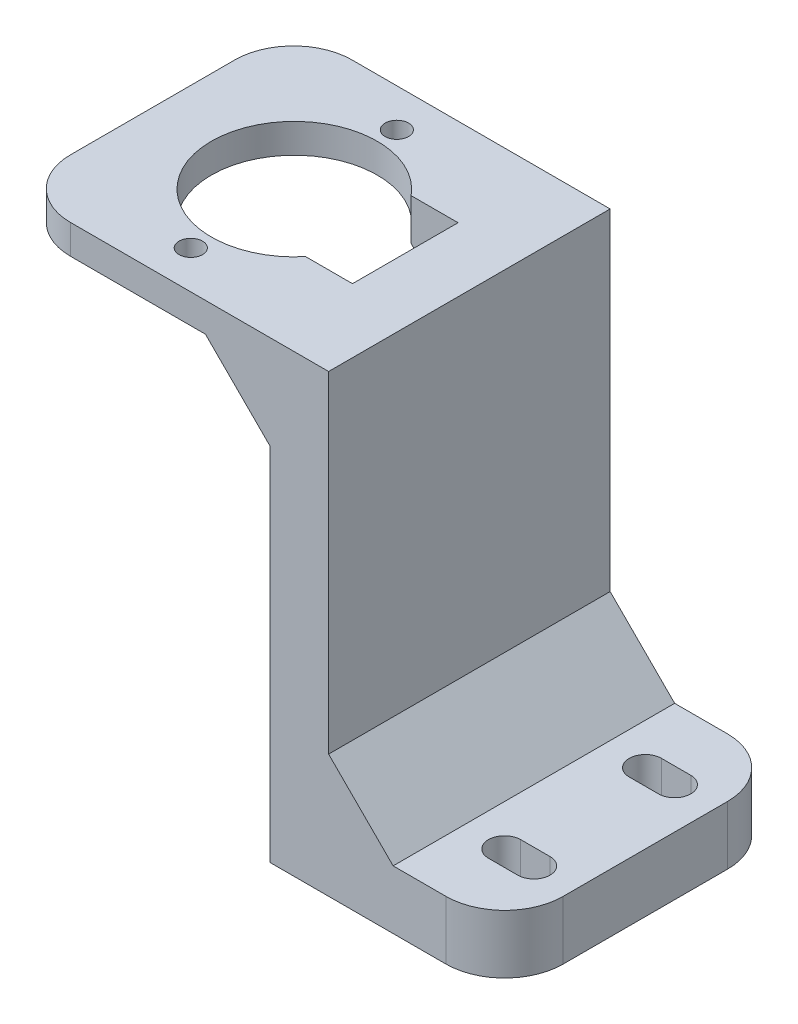
ISO-10303-21;
HEADER;
FILE_DESCRIPTION(('STEP AP214'),'2;1');
FILE_NAME('part.step','',(''),(''),'','','');
FILE_SCHEMA(('AUTOMOTIVE_DESIGN { 1 0 10303 214 1 1 1 1 }'));
ENDSEC;
DATA;
#1=APPLICATION_CONTEXT('core data for automotive mechanical design processes');
#2=APPLICATION_PROTOCOL_DEFINITION('international standard','automotive_design',2000,#1);
#3=PRODUCT_CONTEXT('',#1,'mechanical');
#4=PRODUCT('Part','Part','',(#3));
#5=PRODUCT_RELATED_PRODUCT_CATEGORY('part','',(#4));
#6=PRODUCT_DEFINITION_FORMATION('','',#4);
#7=PRODUCT_DEFINITION_CONTEXT('part definition',#1,'design');
#8=PRODUCT_DEFINITION('design','',#6,#7);
#9=PRODUCT_DEFINITION_SHAPE('','',#8);
#10=(LENGTH_UNIT() NAMED_UNIT(*) SI_UNIT(.MILLI.,.METRE.));
#11=(NAMED_UNIT(*) PLANE_ANGLE_UNIT() SI_UNIT($,.RADIAN.));
#12=(NAMED_UNIT(*) SI_UNIT($,.STERADIAN.) SOLID_ANGLE_UNIT());
#13=UNCERTAINTY_MEASURE_WITH_UNIT(LENGTH_MEASURE(1.E-05),#10,'distance_accuracy_value','');
#14=(GEOMETRIC_REPRESENTATION_CONTEXT(3) GLOBAL_UNCERTAINTY_ASSIGNED_CONTEXT((#13)) GLOBAL_UNIT_ASSIGNED_CONTEXT((#10,
#11,#12)) REPRESENTATION_CONTEXT('',''));
#15=CARTESIAN_POINT('',(0.,0.,0.));
#16=DIRECTION('',(0.,0.,1.));
#17=DIRECTION('',(1.,0.,0.));
#18=AXIS2_PLACEMENT_3D('',#15,#16,#17);
#19=CARTESIAN_POINT('',(30.,5.,-24.));
#20=DIRECTION('',(-1.,0.,0.));
#21=DIRECTION('',(0.,0.,1.));
#22=AXIS2_PLACEMENT_3D('',#19,#20,#21);
#23=PLANE('',#22);
#24=DIRECTION('',(0.,-1.,0.));
#25=VECTOR('',#24,1.);
#26=CARTESIAN_POINT('',(30.,5.,24.));
#27=LINE('',#26,#25);
#28=CARTESIAN_POINT('',(30.,5.,24.));
#29=VERTEX_POINT('',#28);
#30=CARTESIAN_POINT('',(30.,-51.5,24.));
#31=VERTEX_POINT('',#30);
#32=EDGE_CURVE('E517',#29,#31,#27,.T.);
#33=ORIENTED_EDGE('',*,*,#32,.T.);
#34=DIRECTION('',(0.,0.,-1.));
#35=VECTOR('',#34,1.);
#36=CARTESIAN_POINT('',(30.,-51.5,-24.));
#37=LINE('',#36,#35);
#38=CARTESIAN_POINT('',(30.,-51.5,-24.));
#39=VERTEX_POINT('',#38);
#40=EDGE_CURVE('E542',#31,#39,#37,.T.);
#41=ORIENTED_EDGE('',*,*,#40,.T.);
#42=DIRECTION('',(0.,-1.,0.));
#43=VECTOR('',#42,1.);
#44=CARTESIAN_POINT('',(30.,5.,-24.));
#45=LINE('',#44,#43);
#46=CARTESIAN_POINT('',(30.,5.,-24.));
#47=VERTEX_POINT('',#46);
#48=EDGE_CURVE('E508',#47,#39,#45,.T.);
#49=ORIENTED_EDGE('',*,*,#48,.F.);
#50=DIRECTION('',(0.,0.,-1.));
#51=VECTOR('',#50,1.);
#52=CARTESIAN_POINT('',(30.,5.,-24.));
#53=LINE('',#52,#51);
#54=EDGE_CURVE('E503',#29,#47,#53,.T.);
#55=ORIENTED_EDGE('',*,*,#54,.F.);
#56=EDGE_LOOP('',(#33,#41,#49,#55));
#57=FACE_BOUND('',#56,.T.);
#58=ADVANCED_FACE('F190',(#57),#23,.F.);
#59=CARTESIAN_POINT('',(0.,0.,0.));
#60=DIRECTION('',(0.,1.,0.));
#61=DIRECTION('',(0.,0.,1.));
#62=AXIS2_PLACEMENT_3D('',#59,#60,#61);
#63=PLANE('',#62);
#64=CARTESIAN_POINT('',(0.133743502610051,0.,-17.4994889261232));
#65=DIRECTION('',(0.,1.,0.));
#66=DIRECTION('',(0.,0.,1.));
#67=AXIS2_PLACEMENT_3D('',#64,#65,#66);
#68=CIRCLE('',#67,2.);
#69=CARTESIAN_POINT('',(0.133743502610051,0.,-15.4994889261232));
#70=VERTEX_POINT('',#69);
#71=EDGE_CURVE('E464',#70,#70,#68,.T.);
#72=ORIENTED_EDGE('',*,*,#71,.T.);
#73=EDGE_LOOP('',(#72));
#74=FACE_BOUND('',#73,.T.);
#75=CARTESIAN_POINT('',(0.,0.,17.5));
#76=DIRECTION('',(0.,1.,0.));
#77=DIRECTION('',(0.,0.,1.));
#78=AXIS2_PLACEMENT_3D('',#75,#76,#77);
#79=CIRCLE('',#78,2.);
#80=CARTESIAN_POINT('',(0.,0.,19.5));
#81=VERTEX_POINT('',#80);
#82=EDGE_CURVE('E468',#81,#81,#79,.T.);
#83=ORIENTED_EDGE('',*,*,#82,.T.);
#84=EDGE_LOOP('',(#83));
#85=FACE_BOUND('',#84,.T.);
#86=DIRECTION('',(-1.,0.,0.));
#87=VECTOR('',#86,1.);
#88=CARTESIAN_POINT('',(-24.,0.,-24.));
#89=LINE('',#88,#87);
#90=CARTESIAN_POINT('',(8.99999999999993,0.,-24.));
#91=VERTEX_POINT('',#90);
#92=CARTESIAN_POINT('',(-14.,0.,-24.));
#93=VERTEX_POINT('',#92);
#94=EDGE_CURVE('E501',#91,#93,#89,.T.);
#95=ORIENTED_EDGE('',*,*,#94,.F.);
#96=DIRECTION('',(0.,0.,1.));
#97=VECTOR('',#96,1.);
#98=CARTESIAN_POINT('',(8.99999999999992,0.,24.));
#99=LINE('',#98,#97);
#100=CARTESIAN_POINT('',(8.99999999999993,0.,-11.0408333018845));
#101=VERTEX_POINT('',#100);
#102=EDGE_CURVE('E549',#91,#101,#99,.T.);
#103=ORIENTED_EDGE('',*,*,#102,.T.);
#104=CARTESIAN_POINT('',(0.150000000000006,0.,0.));
#105=DIRECTION('',(0.,1.,0.));
#106=DIRECTION('',(0.,0.,1.));
#107=AXIS2_PLACEMENT_3D('',#104,#105,#106);
#108=CIRCLE('',#107,14.15);
#109=CARTESIAN_POINT('',(8.99999999999992,0.,11.0408333018845));
#110=VERTEX_POINT('',#109);
#111=EDGE_CURVE('E474',#101,#110,#108,.T.);
#112=ORIENTED_EDGE('',*,*,#111,.T.);
#113=DIRECTION('',(0.,0.,1.));
#114=VECTOR('',#113,1.);
#115=CARTESIAN_POINT('',(8.99999999999992,0.,24.));
#116=LINE('',#115,#114);
#117=CARTESIAN_POINT('',(8.99999999999992,0.,24.));
#118=VERTEX_POINT('',#117);
#119=EDGE_CURVE('E547',#110,#118,#116,.T.);
#120=ORIENTED_EDGE('',*,*,#119,.T.);
#121=DIRECTION('',(1.,0.,0.));
#122=VECTOR('',#121,1.);
#123=CARTESIAN_POINT('',(-24.,0.,24.));
#124=LINE('',#123,#122);
#125=CARTESIAN_POINT('',(-14.,0.,24.));
#126=VERTEX_POINT('',#125);
#127=EDGE_CURVE('E511',#126,#118,#124,.T.);
#128=ORIENTED_EDGE('',*,*,#127,.F.);
#129=CARTESIAN_POINT('',(-14.,0.,14.));
#130=DIRECTION('',(0.,1.,0.));
#131=DIRECTION('',(0.,0.,1.));
#132=AXIS2_PLACEMENT_3D('',#129,#130,#131);
#133=CIRCLE('',#132,10.);
#134=CARTESIAN_POINT('',(-24.,0.,14.));
#135=VERTEX_POINT('',#134);
#136=EDGE_CURVE('E525',#126,#135,#133,.F.);
#137=ORIENTED_EDGE('',*,*,#136,.T.);
#138=DIRECTION('',(0.,0.,1.));
#139=VECTOR('',#138,1.);
#140=CARTESIAN_POINT('',(-24.,0.,-24.));
#141=LINE('',#140,#139);
#142=CARTESIAN_POINT('',(-24.,0.,-14.));
#143=VERTEX_POINT('',#142);
#144=EDGE_CURVE('E496',#143,#135,#141,.T.);
#145=ORIENTED_EDGE('',*,*,#144,.F.);
#146=CARTESIAN_POINT('',(-14.,0.,-14.));
#147=DIRECTION('',(0.,1.,0.));
#148=DIRECTION('',(0.,0.,1.));
#149=AXIS2_PLACEMENT_3D('',#146,#147,#148);
#150=CIRCLE('',#149,10.);
#151=EDGE_CURVE('E527',#143,#93,#150,.F.);
#152=ORIENTED_EDGE('',*,*,#151,.T.);
#153=EDGE_LOOP('',(#95,#103,#112,#120,#128,#137,#145,#152));
#154=FACE_BOUND('',#153,.T.);
#155=ADVANCED_FACE('F620',(#74,#85,#154),#63,.F.);
#156=CARTESIAN_POINT('',(0.,5.,0.));
#157=DIRECTION('',(0.,1.,0.));
#158=DIRECTION('',(0.,0.,1.));
#159=AXIS2_PLACEMENT_3D('',#156,#157,#158);
#160=PLANE('',#159);
#161=CARTESIAN_POINT('',(0.,5.,17.5));
#162=DIRECTION('',(0.,1.,0.));
#163=DIRECTION('',(0.,0.,1.));
#164=AXIS2_PLACEMENT_3D('',#161,#162,#163);
#165=CIRCLE('',#164,2.);
#166=CARTESIAN_POINT('',(0.,5.,19.5));
#167=VERTEX_POINT('',#166);
#168=EDGE_CURVE('E471',#167,#167,#165,.T.);
#169=ORIENTED_EDGE('',*,*,#168,.F.);
#170=EDGE_LOOP('',(#169));
#171=FACE_BOUND('',#170,.T.);
#172=DIRECTION('',(-1.,0.,0.));
#173=VECTOR('',#172,1.);
#174=CARTESIAN_POINT('',(-24.,5.,-24.));
#175=LINE('',#174,#173);
#176=CARTESIAN_POINT('',(-14.,5.,-24.));
#177=VERTEX_POINT('',#176);
#178=EDGE_CURVE('E505',#47,#177,#175,.T.);
#179=ORIENTED_EDGE('',*,*,#178,.T.);
#180=CARTESIAN_POINT('',(-14.,5.,-14.));
#181=DIRECTION('',(0.,1.,0.));
#182=DIRECTION('',(0.,0.,1.));
#183=AXIS2_PLACEMENT_3D('',#180,#181,#182);
#184=CIRCLE('',#183,10.);
#185=CARTESIAN_POINT('',(-24.,5.,-14.));
#186=VERTEX_POINT('',#185);
#187=EDGE_CURVE('E534',#177,#186,#184,.T.);
#188=ORIENTED_EDGE('',*,*,#187,.T.);
#189=DIRECTION('',(0.,0.,1.));
#190=VECTOR('',#189,1.);
#191=CARTESIAN_POINT('',(-24.,5.,-24.));
#192=LINE('',#191,#190);
#193=CARTESIAN_POINT('',(-24.,5.,14.));
#194=VERTEX_POINT('',#193);
#195=EDGE_CURVE('E497',#186,#194,#192,.T.);
#196=ORIENTED_EDGE('',*,*,#195,.T.);
#197=CARTESIAN_POINT('',(-14.,5.,14.));
#198=DIRECTION('',(0.,1.,0.));
#199=DIRECTION('',(0.,0.,1.));
#200=AXIS2_PLACEMENT_3D('',#197,#198,#199);
#201=CIRCLE('',#200,10.);
#202=CARTESIAN_POINT('',(-14.,5.,24.));
#203=VERTEX_POINT('',#202);
#204=EDGE_CURVE('E532',#194,#203,#201,.T.);
#205=ORIENTED_EDGE('',*,*,#204,.T.);
#206=DIRECTION('',(1.,0.,0.));
#207=VECTOR('',#206,1.);
#208=CARTESIAN_POINT('',(-24.,5.,24.));
#209=LINE('',#208,#207);
#210=EDGE_CURVE('E500',#203,#29,#209,.T.);
#211=ORIENTED_EDGE('',*,*,#210,.T.);
#212=ORIENTED_EDGE('',*,*,#54,.T.);
#213=EDGE_LOOP('',(#179,#188,#196,#205,#211,#212));
#214=FACE_BOUND('',#213,.T.);
#215=DIRECTION('',(-1.,0.,0.));
#216=VECTOR('',#215,1.);
#217=CARTESIAN_POINT('',(19.0689056228177,5.,-9.00000000000001));
#218=LINE('',#217,#216);
#219=CARTESIAN_POINT('',(19.0689056228177,5.,-9.00000000000001));
#220=VERTEX_POINT('',#219);
#221=CARTESIAN_POINT('',(11.0689056228177,5.,-9.00000000000001));
#222=VERTEX_POINT('',#221);
#223=EDGE_CURVE('E479',#220,#222,#218,.T.);
#224=ORIENTED_EDGE('',*,*,#223,.F.);
#225=DIRECTION('',(0.,0.,-1.));
#226=VECTOR('',#225,1.);
#227=CARTESIAN_POINT('',(19.0689056228177,5.,-9.00000000000001));
#228=LINE('',#227,#226);
#229=CARTESIAN_POINT('',(19.0689056228177,5.,8.99999999999999));
#230=VERTEX_POINT('',#229);
#231=EDGE_CURVE('E477',#230,#220,#228,.T.);
#232=ORIENTED_EDGE('',*,*,#231,.F.);
#233=DIRECTION('',(1.,0.,0.));
#234=VECTOR('',#233,1.);
#235=CARTESIAN_POINT('',(19.0689056228177,5.,8.99999999999999));
#236=LINE('',#235,#234);
#237=CARTESIAN_POINT('',(11.0689056228177,5.,8.99999999999999));
#238=VERTEX_POINT('',#237);
#239=EDGE_CURVE('E484',#238,#230,#236,.T.);
#240=ORIENTED_EDGE('',*,*,#239,.F.);
#241=CARTESIAN_POINT('',(0.150000000000006,5.,0.));
#242=DIRECTION('',(0.,1.,0.));
#243=DIRECTION('',(0.,0.,1.));
#244=AXIS2_PLACEMENT_3D('',#241,#242,#243);
#245=CIRCLE('',#244,14.15);
#246=EDGE_CURVE('E481',#222,#238,#245,.T.);
#247=ORIENTED_EDGE('',*,*,#246,.F.);
#248=EDGE_LOOP('',(#224,#232,#240,#247));
#249=FACE_BOUND('',#248,.T.);
#250=CARTESIAN_POINT('',(0.133743502610051,5.,-17.4994889261232));
#251=DIRECTION('',(0.,1.,0.));
#252=DIRECTION('',(0.,0.,1.));
#253=AXIS2_PLACEMENT_3D('',#250,#251,#252);
#254=CIRCLE('',#253,2.);
#255=CARTESIAN_POINT('',(0.133743502610051,5.,-15.4994889261232));
#256=VERTEX_POINT('',#255);
#257=EDGE_CURVE('E465',#256,#256,#254,.T.);
#258=ORIENTED_EDGE('',*,*,#257,.F.);
#259=EDGE_LOOP('',(#258));
#260=FACE_BOUND('',#259,.T.);
#261=ADVANCED_FACE('F648',(#171,#214,#249,#260),#160,.T.);
#262=CARTESIAN_POINT('',(-24.,5.,-24.));
#263=DIRECTION('',(1.,0.,0.));
#264=DIRECTION('',(0.,0.,-1.));
#265=AXIS2_PLACEMENT_3D('',#262,#263,#264);
#266=PLANE('',#265);
#267=ORIENTED_EDGE('',*,*,#195,.F.);
#268=DIRECTION('',(0.,-1.,0.));
#269=VECTOR('',#268,1.);
#270=CARTESIAN_POINT('',(-24.,5.,-14.));
#271=LINE('',#270,#269);
#272=EDGE_CURVE('E522',#186,#143,#271,.T.);
#273=ORIENTED_EDGE('',*,*,#272,.T.);
#274=ORIENTED_EDGE('',*,*,#144,.T.);
#275=DIRECTION('',(0.,-1.,0.));
#276=VECTOR('',#275,1.);
#277=CARTESIAN_POINT('',(-24.,5.,14.));
#278=LINE('',#277,#276);
#279=EDGE_CURVE('E520',#135,#194,#278,.F.);
#280=ORIENTED_EDGE('',*,*,#279,.T.);
#281=EDGE_LOOP('',(#267,#273,#274,#280));
#282=FACE_BOUND('',#281,.T.);
#283=ADVANCED_FACE('F643',(#282),#266,.F.);
#284=CARTESIAN_POINT('',(-24.,5.,24.));
#285=DIRECTION('',(0.,0.,-1.));
#286=DIRECTION('',(-1.,0.,0.));
#287=AXIS2_PLACEMENT_3D('',#284,#285,#286);
#288=PLANE('',#287);
#289=DIRECTION('',(-1.,0.,0.));
#290=VECTOR('',#289,1.);
#291=CARTESIAN_POINT('',(30.,-72.5,24.));
#292=LINE('',#291,#290);
#293=CARTESIAN_POINT('',(50.,-72.5,24.));
#294=VERTEX_POINT('',#293);
#295=CARTESIAN_POINT('',(20.,-72.5,24.));
#296=VERTEX_POINT('',#295);
#297=EDGE_CURVE('E452',#294,#296,#292,.T.);
#298=ORIENTED_EDGE('',*,*,#297,.F.);
#299=DIRECTION('',(0.,-1.,0.));
#300=VECTOR('',#299,1.);
#301=CARTESIAN_POINT('',(50.,5.,24.));
#302=LINE('',#301,#300);
#303=CARTESIAN_POINT('',(50.,-62.5,24.));
#304=VERTEX_POINT('',#303);
#305=EDGE_CURVE('E13',#294,#304,#302,.F.);
#306=ORIENTED_EDGE('',*,*,#305,.T.);
#307=DIRECTION('',(-1.,0.,0.));
#308=VECTOR('',#307,1.);
#309=CARTESIAN_POINT('',(60.,-62.5,24.));
#310=LINE('',#309,#308);
#311=CARTESIAN_POINT('',(41.0000000000001,-62.5,24.));
#312=VERTEX_POINT('',#311);
#313=EDGE_CURVE('E448',#304,#312,#310,.T.);
#314=ORIENTED_EDGE('',*,*,#313,.T.);
#315=DIRECTION('',(0.707106781186551,-0.707106781186544,0.));
#316=VECTOR('',#315,1.);
#317=CARTESIAN_POINT('',(-25.2500000000003,3.74999999999969,24.));
#318=LINE('',#317,#316);
#319=EDGE_CURVE('E551',#312,#31,#318,.F.);
#320=ORIENTED_EDGE('',*,*,#319,.T.);
#321=ORIENTED_EDGE('',*,*,#32,.F.);
#322=ORIENTED_EDGE('',*,*,#210,.F.);
#323=DIRECTION('',(0.,-1.,0.));
#324=VECTOR('',#323,1.);
#325=CARTESIAN_POINT('',(-14.,5.,24.));
#326=LINE('',#325,#324);
#327=EDGE_CURVE('E536',#203,#126,#326,.T.);
#328=ORIENTED_EDGE('',*,*,#327,.T.);
#329=ORIENTED_EDGE('',*,*,#127,.T.);
#330=DIRECTION('',(-0.707106781186544,0.707106781186551,0.));
#331=VECTOR('',#330,1.);
#332=CARTESIAN_POINT('',(-9.99999999999986,19.,24.));
#333=LINE('',#332,#331);
#334=CARTESIAN_POINT('',(20.,-11.0000000000002,24.));
#335=VERTEX_POINT('',#334);
#336=EDGE_CURVE('E572',#118,#335,#333,.F.);
#337=ORIENTED_EDGE('',*,*,#336,.T.);
#338=DIRECTION('',(0.,1.,0.));
#339=VECTOR('',#338,1.);
#340=CARTESIAN_POINT('',(20.,-72.5,24.));
#341=LINE('',#340,#339);
#342=EDGE_CURVE('E461',#296,#335,#341,.T.);
#343=ORIENTED_EDGE('',*,*,#342,.F.);
#344=EDGE_LOOP('',(#298,#306,#314,#320,#321,#322,#328,#329,#337,#343));
#345=FACE_BOUND('',#344,.T.);
#346=ADVANCED_FACE('F609',(#345),#288,.F.);
#347=CARTESIAN_POINT('',(-24.,5.,-24.));
#348=DIRECTION('',(0.,0.,1.));
#349=DIRECTION('',(1.,0.,0.));
#350=AXIS2_PLACEMENT_3D('',#347,#348,#349);
#351=PLANE('',#350);
#352=DIRECTION('',(-1.,0.,0.));
#353=VECTOR('',#352,1.);
#354=CARTESIAN_POINT('',(60.,-62.5,-24.));
#355=LINE('',#354,#353);
#356=CARTESIAN_POINT('',(50.,-62.5,-24.));
#357=VERTEX_POINT('',#356);
#358=CARTESIAN_POINT('',(41.0000000000001,-62.5,-24.));
#359=VERTEX_POINT('',#358);
#360=EDGE_CURVE('E450',#357,#359,#355,.T.);
#361=ORIENTED_EDGE('',*,*,#360,.F.);
#362=DIRECTION('',(0.,1.,0.));
#363=VECTOR('',#362,1.);
#364=CARTESIAN_POINT('',(50.,5.,-24.));
#365=LINE('',#364,#363);
#366=CARTESIAN_POINT('',(50.,-72.5,-24.));
#367=VERTEX_POINT('',#366);
#368=EDGE_CURVE('E213',#357,#367,#365,.F.);
#369=ORIENTED_EDGE('',*,*,#368,.T.);
#370=DIRECTION('',(1.,0.,0.));
#371=VECTOR('',#370,1.);
#372=CARTESIAN_POINT('',(30.,-72.5,-24.));
#373=LINE('',#372,#371);
#374=CARTESIAN_POINT('',(20.,-72.5,-24.));
#375=VERTEX_POINT('',#374);
#376=EDGE_CURVE('E456',#375,#367,#373,.T.);
#377=ORIENTED_EDGE('',*,*,#376,.F.);
#378=DIRECTION('',(0.,1.,0.));
#379=VECTOR('',#378,1.);
#380=CARTESIAN_POINT('',(20.,-72.5,-24.));
#381=LINE('',#380,#379);
#382=CARTESIAN_POINT('',(20.,-11.0000000000002,-24.));
#383=VERTEX_POINT('',#382);
#384=EDGE_CURVE('E458',#375,#383,#381,.T.);
#385=ORIENTED_EDGE('',*,*,#384,.T.);
#386=DIRECTION('',(0.707106781186544,-0.707106781186551,0.));
#387=VECTOR('',#386,1.);
#388=CARTESIAN_POINT('',(-9.99999999999986,19.,-24.));
#389=LINE('',#388,#387);
#390=EDGE_CURVE('E556',#383,#91,#389,.F.);
#391=ORIENTED_EDGE('',*,*,#390,.T.);
#392=ORIENTED_EDGE('',*,*,#94,.T.);
#393=DIRECTION('',(0.,-1.,0.));
#394=VECTOR('',#393,1.);
#395=CARTESIAN_POINT('',(-14.,5.,-24.));
#396=LINE('',#395,#394);
#397=EDGE_CURVE('E530',#93,#177,#396,.F.);
#398=ORIENTED_EDGE('',*,*,#397,.T.);
#399=ORIENTED_EDGE('',*,*,#178,.F.);
#400=ORIENTED_EDGE('',*,*,#48,.T.);
#401=DIRECTION('',(-0.707106781186551,0.707106781186544,0.));
#402=VECTOR('',#401,1.);
#403=CARTESIAN_POINT('',(-25.2500000000003,3.74999999999969,-24.));
#404=LINE('',#403,#402);
#405=EDGE_CURVE('E553',#39,#359,#404,.F.);
#406=ORIENTED_EDGE('',*,*,#405,.T.);
#407=EDGE_LOOP('',(#361,#369,#377,#385,#391,#392,#398,#399,#400,#406));
#408=FACE_BOUND('',#407,.T.);
#409=ADVANCED_FACE('F595',(#408),#351,.F.);
#410=CARTESIAN_POINT('',(19.0689056228177,5.,-9.00000000000001));
#411=DIRECTION('',(-1.,0.,0.));
#412=DIRECTION('',(0.,0.,1.));
#413=AXIS2_PLACEMENT_3D('',#410,#411,#412);
#414=PLANE('',#413);
#415=DIRECTION('',(0.,-1.,0.));
#416=VECTOR('',#415,1.);
#417=CARTESIAN_POINT('',(19.0689056228177,5.,-9.00000000000001));
#418=LINE('',#417,#416);
#419=CARTESIAN_POINT('',(19.0689056228177,-10.0689056228179,-9.00000000000001));
#420=VERTEX_POINT('',#419);
#421=EDGE_CURVE('E494',#220,#420,#418,.T.);
#422=ORIENTED_EDGE('',*,*,#421,.T.);
#423=DIRECTION('',(0.,0.,-1.));
#424=VECTOR('',#423,1.);
#425=CARTESIAN_POINT('',(19.0689056228177,-10.0689056228179,24.));
#426=LINE('',#425,#424);
#427=CARTESIAN_POINT('',(19.0689056228177,-10.0689056228179,8.99999999999999));
#428=VERTEX_POINT('',#427);
#429=EDGE_CURVE('E564',#420,#428,#426,.F.);
#430=ORIENTED_EDGE('',*,*,#429,.T.);
#431=DIRECTION('',(0.,-1.,0.));
#432=VECTOR('',#431,1.);
#433=CARTESIAN_POINT('',(19.0689056228177,5.,8.99999999999999));
#434=LINE('',#433,#432);
#435=EDGE_CURVE('E486',#230,#428,#434,.T.);
#436=ORIENTED_EDGE('',*,*,#435,.F.);
#437=ORIENTED_EDGE('',*,*,#231,.T.);
#438=EDGE_LOOP('',(#422,#430,#436,#437));
#439=FACE_BOUND('',#438,.T.);
#440=ADVANCED_FACE('F686',(#439),#414,.T.);
#441=CARTESIAN_POINT('',(19.0689056228177,5.,-9.00000000000001));
#442=DIRECTION('',(0.,0.,1.));
#443=DIRECTION('',(1.,0.,0.));
#444=AXIS2_PLACEMENT_3D('',#441,#442,#443);
#445=PLANE('',#444);
#446=DIRECTION('',(0.,-1.,0.));
#447=VECTOR('',#446,1.);
#448=CARTESIAN_POINT('',(11.0689056228177,5.,-9.00000000000001));
#449=LINE('',#448,#447);
#450=CARTESIAN_POINT('',(11.0689056228177,-2.0689056228178,-9.00000000000001));
#451=VERTEX_POINT('',#450);
#452=EDGE_CURVE('E492',#222,#451,#449,.T.);
#453=ORIENTED_EDGE('',*,*,#452,.T.);
#454=DIRECTION('',(-0.707106781186544,0.707106781186551,0.));
#455=VECTOR('',#454,1.);
#456=CARTESIAN_POINT('',(20.,-11.0000000000002,-9.00000000000001));
#457=LINE('',#456,#455);
#458=EDGE_CURVE('E561',#451,#420,#457,.F.);
#459=ORIENTED_EDGE('',*,*,#458,.T.);
#460=ORIENTED_EDGE('',*,*,#421,.F.);
#461=ORIENTED_EDGE('',*,*,#223,.T.);
#462=EDGE_LOOP('',(#453,#459,#460,#461));
#463=FACE_BOUND('',#462,.T.);
#464=ADVANCED_FACE('F689',(#463),#445,.T.);
#465=CARTESIAN_POINT('',(0.150000000000006,5.,0.));
#466=DIRECTION('',(0.,-1.,0.));
#467=DIRECTION('',(0.,0.,-1.));
#468=AXIS2_PLACEMENT_3D('',#465,#466,#467);
#469=CYLINDRICAL_SURFACE('',#468,14.15);
#470=ORIENTED_EDGE('',*,*,#111,.F.);
#471=CARTESIAN_POINT('',(0.150000000000006,8.85000000000001,0.));
#472=DIRECTION('',(-0.707106781186551,-0.707106781186544,0.));
#473=DIRECTION('',(0.707106781186544,-0.707106781186551,0.));
#474=AXIS2_PLACEMENT_3D('',#471,#472,#473);
#475=ELLIPSE('',#474,20.0111219075794,14.15);
#476=EDGE_CURVE('E558',#101,#451,#475,.T.);
#477=ORIENTED_EDGE('',*,*,#476,.T.);
#478=ORIENTED_EDGE('',*,*,#452,.F.);
#479=ORIENTED_EDGE('',*,*,#246,.T.);
#480=DIRECTION('',(0.,-1.,0.));
#481=VECTOR('',#480,1.);
#482=CARTESIAN_POINT('',(11.0689056228177,5.,8.99999999999999));
#483=LINE('',#482,#481);
#484=CARTESIAN_POINT('',(11.0689056228177,-2.06890562281781,8.99999999999999));
#485=VERTEX_POINT('',#484);
#486=EDGE_CURVE('E490',#238,#485,#483,.T.);
#487=ORIENTED_EDGE('',*,*,#486,.T.);
#488=CARTESIAN_POINT('',(0.150000000000006,8.85000000000001,0.));
#489=DIRECTION('',(-0.707106781186551,-0.707106781186544,0.));
#490=DIRECTION('',(0.707106781186544,-0.707106781186551,0.));
#491=AXIS2_PLACEMENT_3D('',#488,#489,#490);
#492=ELLIPSE('',#491,20.0111219075794,14.15);
#493=EDGE_CURVE('E570',#485,#110,#492,.T.);
#494=ORIENTED_EDGE('',*,*,#493,.T.);
#495=EDGE_LOOP('',(#470,#477,#478,#479,#487,#494));
#496=FACE_BOUND('',#495,.T.);
#497=ADVANCED_FACE('F630',(#496),#469,.F.);
#498=CARTESIAN_POINT('',(19.0689056228177,5.,8.99999999999999));
#499=DIRECTION('',(0.,0.,-1.));
#500=DIRECTION('',(-1.,0.,0.));
#501=AXIS2_PLACEMENT_3D('',#498,#499,#500);
#502=PLANE('',#501);
#503=ORIENTED_EDGE('',*,*,#435,.T.);
#504=DIRECTION('',(0.707106781186544,-0.707106781186551,0.));
#505=VECTOR('',#504,1.);
#506=CARTESIAN_POINT('',(20.,-11.0000000000002,8.99999999999999));
#507=LINE('',#506,#505);
#508=EDGE_CURVE('E567',#428,#485,#507,.F.);
#509=ORIENTED_EDGE('',*,*,#508,.T.);
#510=ORIENTED_EDGE('',*,*,#486,.F.);
#511=ORIENTED_EDGE('',*,*,#239,.T.);
#512=EDGE_LOOP('',(#503,#509,#510,#511));
#513=FACE_BOUND('',#512,.T.);
#514=ADVANCED_FACE('F696',(#513),#502,.T.);
#515=CARTESIAN_POINT('',(0.,5.,17.5));
#516=DIRECTION('',(0.,-1.,0.));
#517=DIRECTION('',(0.,0.,-1.));
#518=AXIS2_PLACEMENT_3D('',#515,#516,#517);
#519=CYLINDRICAL_SURFACE('',#518,2.);
#520=ORIENTED_EDGE('',*,*,#168,.T.);
#521=EDGE_LOOP('',(#520));
#522=FACE_BOUND('',#521,.T.);
#523=ORIENTED_EDGE('',*,*,#82,.F.);
#524=EDGE_LOOP('',(#523));
#525=FACE_BOUND('',#524,.T.);
#526=ADVANCED_FACE('F699',(#522,#525),#519,.F.);
#527=CARTESIAN_POINT('',(0.133743502610051,5.,-17.4994889261232));
#528=DIRECTION('',(0.,-1.,0.));
#529=DIRECTION('',(0.,0.,-1.));
#530=AXIS2_PLACEMENT_3D('',#527,#528,#529);
#531=CYLINDRICAL_SURFACE('',#530,2.);
#532=ORIENTED_EDGE('',*,*,#257,.T.);
#533=EDGE_LOOP('',(#532));
#534=FACE_BOUND('',#533,.T.);
#535=ORIENTED_EDGE('',*,*,#71,.F.);
#536=EDGE_LOOP('',(#535));
#537=FACE_BOUND('',#536,.T.);
#538=ADVANCED_FACE('F703',(#534,#537),#531,.F.);
#539=CARTESIAN_POINT('',(20.,-72.5,24.));
#540=DIRECTION('',(1.,0.,0.));
#541=DIRECTION('',(0.,0.,-1.));
#542=AXIS2_PLACEMENT_3D('',#539,#540,#541);
#543=PLANE('',#542);
#544=ORIENTED_EDGE('',*,*,#342,.T.);
#545=DIRECTION('',(0.,0.,-1.));
#546=VECTOR('',#545,1.);
#547=CARTESIAN_POINT('',(20.,-11.0000000000002,-24.));
#548=LINE('',#547,#546);
#549=EDGE_CURVE('E544',#335,#383,#548,.T.);
#550=ORIENTED_EDGE('',*,*,#549,.T.);
#551=ORIENTED_EDGE('',*,*,#384,.F.);
#552=DIRECTION('',(0.,0.,-1.));
#553=VECTOR('',#552,1.);
#554=CARTESIAN_POINT('',(20.,-72.5,24.));
#555=LINE('',#554,#553);
#556=EDGE_CURVE('E454',#296,#375,#555,.T.);
#557=ORIENTED_EDGE('',*,*,#556,.F.);
#558=EDGE_LOOP('',(#544,#550,#551,#557));
#559=FACE_BOUND('',#558,.T.);
#560=ADVANCED_FACE('F614',(#559),#543,.F.);
#561=CARTESIAN_POINT('',(0.,-72.5,0.));
#562=DIRECTION('',(0.,1.,0.));
#563=DIRECTION('',(0.,0.,1.));
#564=AXIS2_PLACEMENT_3D('',#561,#562,#563);
#565=PLANE('',#564);
#566=DIRECTION('',(1.,0.,0.));
#567=VECTOR('',#566,1.);
#568=CARTESIAN_POINT('',(48.,-72.5,14.75));
#569=LINE('',#568,#567);
#570=CARTESIAN_POINT('',(48.,-72.5,14.75));
#571=VERTEX_POINT('',#570);
#572=CARTESIAN_POINT('',(53.,-72.5,14.75));
#573=VERTEX_POINT('',#572);
#574=EDGE_CURVE('E746',#571,#573,#569,.T.);
#575=ORIENTED_EDGE('',*,*,#574,.T.);
#576=CARTESIAN_POINT('',(53.,-72.5,12.));
#577=DIRECTION('',(0.,1.,0.));
#578=DIRECTION('',(0.,0.,1.));
#579=AXIS2_PLACEMENT_3D('',#576,#577,#578);
#580=CIRCLE('',#579,2.75);
#581=CARTESIAN_POINT('',(53.,-72.5,9.25));
#582=VERTEX_POINT('',#581);
#583=EDGE_CURVE('E403',#573,#582,#580,.T.);
#584=ORIENTED_EDGE('',*,*,#583,.T.);
#585=DIRECTION('',(1.,0.,0.));
#586=VECTOR('',#585,1.);
#587=CARTESIAN_POINT('',(48.,-72.5,9.25));
#588=LINE('',#587,#586);
#589=CARTESIAN_POINT('',(48.,-72.5,9.25));
#590=VERTEX_POINT('',#589);
#591=EDGE_CURVE('E382',#590,#582,#588,.T.);
#592=ORIENTED_EDGE('',*,*,#591,.F.);
#593=CARTESIAN_POINT('',(48.,-72.5,12.));
#594=DIRECTION('',(0.,1.,0.));
#595=DIRECTION('',(0.,0.,1.));
#596=AXIS2_PLACEMENT_3D('',#593,#594,#595);
#597=CIRCLE('',#596,2.75);
#598=EDGE_CURVE('E389',#590,#571,#597,.T.);
#599=ORIENTED_EDGE('',*,*,#598,.T.);
#600=EDGE_LOOP('',(#575,#584,#592,#599));
#601=FACE_BOUND('',#600,.T.);
#602=DIRECTION('',(1.,0.,0.));
#603=VECTOR('',#602,1.);
#604=CARTESIAN_POINT('',(48.,-72.5,-14.75));
#605=LINE('',#604,#603);
#606=CARTESIAN_POINT('',(48.,-72.5,-14.75));
#607=VERTEX_POINT('',#606);
#608=CARTESIAN_POINT('',(53.,-72.5,-14.75));
#609=VERTEX_POINT('',#608);
#610=EDGE_CURVE('E415',#607,#609,#605,.T.);
#611=ORIENTED_EDGE('',*,*,#610,.F.);
#612=CARTESIAN_POINT('',(48.,-72.5,-12.));
#613=DIRECTION('',(0.,1.,0.));
#614=DIRECTION('',(0.,0.,1.));
#615=AXIS2_PLACEMENT_3D('',#612,#613,#614);
#616=CIRCLE('',#615,2.75);
#617=CARTESIAN_POINT('',(48.,-72.5,-9.24999999999999));
#618=VERTEX_POINT('',#617);
#619=EDGE_CURVE('E424',#607,#618,#616,.T.);
#620=ORIENTED_EDGE('',*,*,#619,.T.);
#621=DIRECTION('',(1.,0.,0.));
#622=VECTOR('',#621,1.);
#623=CARTESIAN_POINT('',(48.,-72.5,-9.24999999999999));
#624=LINE('',#623,#622);
#625=CARTESIAN_POINT('',(53.,-72.5,-9.24999999999999));
#626=VERTEX_POINT('',#625);
#627=EDGE_CURVE('E412',#618,#626,#624,.T.);
#628=ORIENTED_EDGE('',*,*,#627,.T.);
#629=CARTESIAN_POINT('',(53.,-72.5,-12.));
#630=DIRECTION('',(0.,1.,0.));
#631=DIRECTION('',(0.,0.,1.));
#632=AXIS2_PLACEMENT_3D('',#629,#630,#631);
#633=CIRCLE('',#632,2.75);
#634=EDGE_CURVE('E434',#626,#609,#633,.T.);
#635=ORIENTED_EDGE('',*,*,#634,.T.);
#636=EDGE_LOOP('',(#611,#620,#628,#635));
#637=FACE_BOUND('',#636,.T.);
#638=ORIENTED_EDGE('',*,*,#376,.T.);
#639=CARTESIAN_POINT('',(50.,-72.5,-14.));
#640=DIRECTION('',(0.,1.,0.));
#641=DIRECTION('',(0.,0.,1.));
#642=AXIS2_PLACEMENT_3D('',#639,#640,#641);
#643=CIRCLE('',#642,10.);
#644=CARTESIAN_POINT('',(60.,-72.5,-14.));
#645=VERTEX_POINT('',#644);
#646=EDGE_CURVE('E198',#367,#645,#643,.F.);
#647=ORIENTED_EDGE('',*,*,#646,.T.);
#648=DIRECTION('',(0.,0.,-1.));
#649=VECTOR('',#648,1.);
#650=CARTESIAN_POINT('',(60.,-72.5,24.));
#651=LINE('',#650,#649);
#652=CARTESIAN_POINT('',(60.,-72.5,14.));
#653=VERTEX_POINT('',#652);
#654=EDGE_CURVE('E442',#653,#645,#651,.T.);
#655=ORIENTED_EDGE('',*,*,#654,.F.);
#656=CARTESIAN_POINT('',(50.,-72.5,14.));
#657=DIRECTION('',(0.,1.,0.));
#658=DIRECTION('',(0.,0.,1.));
#659=AXIS2_PLACEMENT_3D('',#656,#657,#658);
#660=CIRCLE('',#659,10.);
#661=EDGE_CURVE('E205',#653,#294,#660,.F.);
#662=ORIENTED_EDGE('',*,*,#661,.T.);
#663=ORIENTED_EDGE('',*,*,#297,.T.);
#664=ORIENTED_EDGE('',*,*,#556,.T.);
#665=EDGE_LOOP('',(#638,#647,#655,#662,#663,#664));
#666=FACE_BOUND('',#665,.T.);
#667=ADVANCED_FACE('F586',(#601,#637,#666),#565,.F.);
#668=CARTESIAN_POINT('',(60.,-62.5,24.));
#669=DIRECTION('',(0.,-1.,0.));
#670=DIRECTION('',(0.,0.,-1.));
#671=AXIS2_PLACEMENT_3D('',#668,#669,#670);
#672=PLANE('',#671);
#673=CARTESIAN_POINT('',(48.,-62.5,12.));
#674=DIRECTION('',(0.,1.,0.));
#675=DIRECTION('',(0.,0.,1.));
#676=AXIS2_PLACEMENT_3D('',#673,#674,#675);
#677=CIRCLE('',#676,2.75);
#678=CARTESIAN_POINT('',(48.,-62.5,9.24999999999999));
#679=VERTEX_POINT('',#678);
#680=CARTESIAN_POINT('',(48.,-62.5,14.75));
#681=VERTEX_POINT('',#680);
#682=EDGE_CURVE('E381',#679,#681,#677,.T.);
#683=ORIENTED_EDGE('',*,*,#682,.F.);
#684=DIRECTION('',(1.,0.,0.));
#685=VECTOR('',#684,1.);
#686=CARTESIAN_POINT('',(48.,-62.5,9.24999999999999));
#687=LINE('',#686,#685);
#688=CARTESIAN_POINT('',(53.,-62.5,9.24999999999999));
#689=VERTEX_POINT('',#688);
#690=EDGE_CURVE('E370',#679,#689,#687,.T.);
#691=ORIENTED_EDGE('',*,*,#690,.T.);
#692=CARTESIAN_POINT('',(53.,-62.5,12.));
#693=DIRECTION('',(0.,1.,0.));
#694=DIRECTION('',(0.,0.,1.));
#695=AXIS2_PLACEMENT_3D('',#692,#693,#694);
#696=CIRCLE('',#695,2.75);
#697=CARTESIAN_POINT('',(53.,-62.5,14.75));
#698=VERTEX_POINT('',#697);
#699=EDGE_CURVE('E390',#698,#689,#696,.T.);
#700=ORIENTED_EDGE('',*,*,#699,.F.);
#701=DIRECTION('',(1.,0.,0.));
#702=VECTOR('',#701,1.);
#703=CARTESIAN_POINT('',(48.,-62.5,14.75));
#704=LINE('',#703,#702);
#705=EDGE_CURVE('E396',#681,#698,#704,.T.);
#706=ORIENTED_EDGE('',*,*,#705,.F.);
#707=EDGE_LOOP('',(#683,#691,#700,#706));
#708=FACE_BOUND('',#707,.T.);
#709=CARTESIAN_POINT('',(53.,-62.5,-12.));
#710=DIRECTION('',(0.,1.,0.));
#711=DIRECTION('',(0.,0.,1.));
#712=AXIS2_PLACEMENT_3D('',#709,#710,#711);
#713=CIRCLE('',#712,2.75);
#714=CARTESIAN_POINT('',(53.,-62.5,-9.25000000000002));
#715=VERTEX_POINT('',#714);
#716=CARTESIAN_POINT('',(53.,-62.5,-14.75));
#717=VERTEX_POINT('',#716);
#718=EDGE_CURVE('E431',#715,#717,#713,.T.);
#719=ORIENTED_EDGE('',*,*,#718,.F.);
#720=DIRECTION('',(1.,0.,0.));
#721=VECTOR('',#720,1.);
#722=CARTESIAN_POINT('',(48.,-62.5,-9.25000000000002));
#723=LINE('',#722,#721);
#724=CARTESIAN_POINT('',(48.,-62.5,-9.24999999999999));
#725=VERTEX_POINT('',#724);
#726=EDGE_CURVE('E410',#725,#715,#723,.T.);
#727=ORIENTED_EDGE('',*,*,#726,.F.);
#728=CARTESIAN_POINT('',(48.,-62.5,-12.));
#729=DIRECTION('',(0.,1.,0.));
#730=DIRECTION('',(0.,0.,1.));
#731=AXIS2_PLACEMENT_3D('',#728,#729,#730);
#732=CIRCLE('',#731,2.75);
#733=CARTESIAN_POINT('',(48.,-62.5,-14.75));
#734=VERTEX_POINT('',#733);
#735=EDGE_CURVE('E421',#734,#725,#732,.T.);
#736=ORIENTED_EDGE('',*,*,#735,.F.);
#737=DIRECTION('',(1.,0.,0.));
#738=VECTOR('',#737,1.);
#739=CARTESIAN_POINT('',(48.,-62.5,-14.75));
#740=LINE('',#739,#738);
#741=EDGE_CURVE('E418',#734,#717,#740,.T.);
#742=ORIENTED_EDGE('',*,*,#741,.T.);
#743=EDGE_LOOP('',(#719,#727,#736,#742));
#744=FACE_BOUND('',#743,.T.);
#745=DIRECTION('',(0.,0.,1.));
#746=VECTOR('',#745,1.);
#747=CARTESIAN_POINT('',(60.,-62.5,24.));
#748=LINE('',#747,#746);
#749=CARTESIAN_POINT('',(60.,-62.5,-14.));
#750=VERTEX_POINT('',#749);
#751=CARTESIAN_POINT('',(60.,-62.5,14.));
#752=VERTEX_POINT('',#751);
#753=EDGE_CURVE('E445',#750,#752,#748,.T.);
#754=ORIENTED_EDGE('',*,*,#753,.F.);
#755=CARTESIAN_POINT('',(50.,-62.5,-14.));
#756=DIRECTION('',(0.,-1.,0.));
#757=DIRECTION('',(0.,0.,-1.));
#758=AXIS2_PLACEMENT_3D('',#755,#756,#757);
#759=CIRCLE('',#758,10.);
#760=EDGE_CURVE('E582',#750,#357,#759,.F.);
#761=ORIENTED_EDGE('',*,*,#760,.T.);
#762=ORIENTED_EDGE('',*,*,#360,.T.);
#763=DIRECTION('',(0.,0.,1.));
#764=VECTOR('',#763,1.);
#765=CARTESIAN_POINT('',(41.0000000000001,-62.5,24.));
#766=LINE('',#765,#764);
#767=EDGE_CURVE('E539',#359,#312,#766,.T.);
#768=ORIENTED_EDGE('',*,*,#767,.T.);
#769=ORIENTED_EDGE('',*,*,#313,.F.);
#770=CARTESIAN_POINT('',(50.,-62.5,14.));
#771=DIRECTION('',(0.,-1.,0.));
#772=DIRECTION('',(0.,0.,-1.));
#773=AXIS2_PLACEMENT_3D('',#770,#771,#772);
#774=CIRCLE('',#773,10.);
#775=EDGE_CURVE('E580',#304,#752,#774,.F.);
#776=ORIENTED_EDGE('',*,*,#775,.T.);
#777=EDGE_LOOP('',(#754,#761,#762,#768,#769,#776));
#778=FACE_BOUND('',#777,.T.);
#779=ADVANCED_FACE('F394',(#708,#744,#778),#672,.F.);
#780=CARTESIAN_POINT('',(60.,0.,0.));
#781=DIRECTION('',(-1.,0.,0.));
#782=DIRECTION('',(0.,0.,1.));
#783=AXIS2_PLACEMENT_3D('',#780,#781,#782);
#784=PLANE('',#783);
#785=ORIENTED_EDGE('',*,*,#654,.T.);
#786=DIRECTION('',(0.,1.,0.));
#787=VECTOR('',#786,1.);
#788=CARTESIAN_POINT('',(60.,0.,-14.));
#789=LINE('',#788,#787);
#790=EDGE_CURVE('E577',#645,#750,#789,.T.);
#791=ORIENTED_EDGE('',*,*,#790,.T.);
#792=ORIENTED_EDGE('',*,*,#753,.T.);
#793=DIRECTION('',(0.,-1.,0.));
#794=VECTOR('',#793,1.);
#795=CARTESIAN_POINT('',(60.,0.,14.));
#796=LINE('',#795,#794);
#797=EDGE_CURVE('E574',#752,#653,#796,.T.);
#798=ORIENTED_EDGE('',*,*,#797,.T.);
#799=EDGE_LOOP('',(#785,#791,#792,#798));
#800=FACE_BOUND('',#799,.T.);
#801=ADVANCED_FACE('F590',(#800),#784,.F.);
#802=CARTESIAN_POINT('',(-14.,5.,-14.));
#803=DIRECTION('',(0.,-1.,0.));
#804=DIRECTION('',(0.,0.,-1.));
#805=AXIS2_PLACEMENT_3D('',#802,#803,#804);
#806=CYLINDRICAL_SURFACE('',#805,10.);
#807=ORIENTED_EDGE('',*,*,#187,.F.);
#808=ORIENTED_EDGE('',*,*,#397,.F.);
#809=ORIENTED_EDGE('',*,*,#151,.F.);
#810=ORIENTED_EDGE('',*,*,#272,.F.);
#811=EDGE_LOOP('',(#807,#808,#809,#810));
#812=FACE_BOUND('',#811,.T.);
#813=ADVANCED_FACE('F655',(#812),#806,.T.);
#814=CARTESIAN_POINT('',(-14.,5.,14.));
#815=DIRECTION('',(0.,-1.,0.));
#816=DIRECTION('',(0.,0.,-1.));
#817=AXIS2_PLACEMENT_3D('',#814,#815,#816);
#818=CYLINDRICAL_SURFACE('',#817,10.);
#819=ORIENTED_EDGE('',*,*,#204,.F.);
#820=ORIENTED_EDGE('',*,*,#279,.F.);
#821=ORIENTED_EDGE('',*,*,#136,.F.);
#822=ORIENTED_EDGE('',*,*,#327,.F.);
#823=EDGE_LOOP('',(#819,#820,#821,#822));
#824=FACE_BOUND('',#823,.T.);
#825=ADVANCED_FACE('F646',(#824),#818,.T.);
#826=CARTESIAN_POINT('',(41.0000000000001,-62.5,24.));
#827=DIRECTION('',(0.707106781186544,0.707106781186551,0.));
#828=DIRECTION('',(0.,0.,-1.));
#829=AXIS2_PLACEMENT_3D('',#826,#827,#828);
#830=PLANE('',#829);
#831=ORIENTED_EDGE('',*,*,#405,.F.);
#832=ORIENTED_EDGE('',*,*,#40,.F.);
#833=ORIENTED_EDGE('',*,*,#319,.F.);
#834=ORIENTED_EDGE('',*,*,#767,.F.);
#835=EDGE_LOOP('',(#831,#832,#833,#834));
#836=FACE_BOUND('',#835,.T.);
#837=ADVANCED_FACE('F603',(#836),#830,.T.);
#838=CARTESIAN_POINT('',(20.,-11.0000000000002,24.));
#839=DIRECTION('',(-0.707106781186551,-0.707106781186544,0.));
#840=DIRECTION('',(0.,0.,1.));
#841=AXIS2_PLACEMENT_3D('',#838,#839,#840);
#842=PLANE('',#841);
#843=ORIENTED_EDGE('',*,*,#476,.F.);
#844=ORIENTED_EDGE('',*,*,#102,.F.);
#845=ORIENTED_EDGE('',*,*,#390,.F.);
#846=ORIENTED_EDGE('',*,*,#549,.F.);
#847=ORIENTED_EDGE('',*,*,#336,.F.);
#848=ORIENTED_EDGE('',*,*,#119,.F.);
#849=ORIENTED_EDGE('',*,*,#493,.F.);
#850=ORIENTED_EDGE('',*,*,#508,.F.);
#851=ORIENTED_EDGE('',*,*,#429,.F.);
#852=ORIENTED_EDGE('',*,*,#458,.F.);
#853=EDGE_LOOP('',(#843,#844,#845,#846,#847,#848,#849,#850,#851,#852));
#854=FACE_BOUND('',#853,.T.);
#855=ADVANCED_FACE('F625',(#854),#842,.T.);
#856=CARTESIAN_POINT('',(53.,-62.5,-12.));
#857=DIRECTION('',(0.,1.,0.));
#858=DIRECTION('',(0.,0.,1.));
#859=AXIS2_PLACEMENT_3D('',#856,#857,#858);
#860=CYLINDRICAL_SURFACE('',#859,2.75);
#861=ORIENTED_EDGE('',*,*,#634,.F.);
#862=DIRECTION('',(0.,1.,0.));
#863=VECTOR('',#862,1.);
#864=CARTESIAN_POINT('',(53.,-62.5,-9.24999999999999));
#865=LINE('',#864,#863);
#866=EDGE_CURVE('E439',#715,#626,#865,.F.);
#867=ORIENTED_EDGE('',*,*,#866,.F.);
#868=ORIENTED_EDGE('',*,*,#718,.T.);
#869=DIRECTION('',(0.,1.,0.));
#870=VECTOR('',#869,1.);
#871=CARTESIAN_POINT('',(53.,-62.5,-14.75));
#872=LINE('',#871,#870);
#873=EDGE_CURVE('E437',#609,#717,#872,.T.);
#874=ORIENTED_EDGE('',*,*,#873,.F.);
#875=EDGE_LOOP('',(#861,#867,#868,#874));
#876=FACE_BOUND('',#875,.T.);
#877=ADVANCED_FACE('F714',(#876),#860,.F.);
#878=CARTESIAN_POINT('',(48.,-62.5,-12.));
#879=DIRECTION('',(0.,1.,0.));
#880=DIRECTION('',(0.,0.,1.));
#881=AXIS2_PLACEMENT_3D('',#878,#879,#880);
#882=CYLINDRICAL_SURFACE('',#881,2.75);
#883=ORIENTED_EDGE('',*,*,#735,.T.);
#884=DIRECTION('',(0.,1.,0.));
#885=VECTOR('',#884,1.);
#886=CARTESIAN_POINT('',(48.,-62.5,-9.24999999999999));
#887=LINE('',#886,#885);
#888=EDGE_CURVE('E427',#618,#725,#887,.T.);
#889=ORIENTED_EDGE('',*,*,#888,.F.);
#890=ORIENTED_EDGE('',*,*,#619,.F.);
#891=DIRECTION('',(0.,1.,0.));
#892=VECTOR('',#891,1.);
#893=CARTESIAN_POINT('',(48.,-62.5,-14.75));
#894=LINE('',#893,#892);
#895=EDGE_CURVE('E429',#734,#607,#894,.F.);
#896=ORIENTED_EDGE('',*,*,#895,.F.);
#897=EDGE_LOOP('',(#883,#889,#890,#896));
#898=FACE_BOUND('',#897,.T.);
#899=ADVANCED_FACE('F717',(#898),#882,.F.);
#900=CARTESIAN_POINT('',(48.,-62.5,-14.75));
#901=DIRECTION('',(0.,0.,-1.));
#902=DIRECTION('',(-1.,0.,0.));
#903=AXIS2_PLACEMENT_3D('',#900,#901,#902);
#904=PLANE('',#903);
#905=ORIENTED_EDGE('',*,*,#873,.T.);
#906=ORIENTED_EDGE('',*,*,#741,.F.);
#907=ORIENTED_EDGE('',*,*,#895,.T.);
#908=ORIENTED_EDGE('',*,*,#610,.T.);
#909=EDGE_LOOP('',(#905,#906,#907,#908));
#910=FACE_BOUND('',#909,.T.);
#911=ADVANCED_FACE('F721',(#910),#904,.F.);
#912=CARTESIAN_POINT('',(48.,-62.5,-9.24999999999999));
#913=DIRECTION('',(0.,0.,1.));
#914=DIRECTION('',(1.,0.,0.));
#915=AXIS2_PLACEMENT_3D('',#912,#913,#914);
#916=PLANE('',#915);
#917=ORIENTED_EDGE('',*,*,#866,.T.);
#918=ORIENTED_EDGE('',*,*,#627,.F.);
#919=ORIENTED_EDGE('',*,*,#888,.T.);
#920=ORIENTED_EDGE('',*,*,#726,.T.);
#921=EDGE_LOOP('',(#917,#918,#919,#920));
#922=FACE_BOUND('',#921,.T.);
#923=ADVANCED_FACE('F725',(#922),#916,.F.);
#924=CARTESIAN_POINT('',(53.,-62.5,12.));
#925=DIRECTION('',(0.,1.,0.));
#926=DIRECTION('',(0.,0.,1.));
#927=AXIS2_PLACEMENT_3D('',#924,#925,#926);
#928=CYLINDRICAL_SURFACE('',#927,2.75);
#929=ORIENTED_EDGE('',*,*,#583,.F.);
#930=DIRECTION('',(0.,1.,0.));
#931=VECTOR('',#930,1.);
#932=CARTESIAN_POINT('',(53.,-62.5,14.75));
#933=LINE('',#932,#931);
#934=EDGE_CURVE('E407',#698,#573,#933,.F.);
#935=ORIENTED_EDGE('',*,*,#934,.F.);
#936=ORIENTED_EDGE('',*,*,#699,.T.);
#937=DIRECTION('',(0.,1.,0.));
#938=VECTOR('',#937,1.);
#939=CARTESIAN_POINT('',(53.,-62.5,9.25));
#940=LINE('',#939,#938);
#941=EDGE_CURVE('E376',#582,#689,#940,.T.);
#942=ORIENTED_EDGE('',*,*,#941,.F.);
#943=EDGE_LOOP('',(#929,#935,#936,#942));
#944=FACE_BOUND('',#943,.T.);
#945=ADVANCED_FACE('F729',(#944),#928,.F.);
#946=CARTESIAN_POINT('',(48.,-62.5,12.));
#947=DIRECTION('',(0.,1.,0.));
#948=DIRECTION('',(0.,0.,1.));
#949=AXIS2_PLACEMENT_3D('',#946,#947,#948);
#950=CYLINDRICAL_SURFACE('',#949,2.75);
#951=ORIENTED_EDGE('',*,*,#682,.T.);
#952=DIRECTION('',(0.,1.,0.));
#953=VECTOR('',#952,1.);
#954=CARTESIAN_POINT('',(48.,-62.5,14.75));
#955=LINE('',#954,#953);
#956=EDGE_CURVE('E391',#571,#681,#955,.T.);
#957=ORIENTED_EDGE('',*,*,#956,.F.);
#958=ORIENTED_EDGE('',*,*,#598,.F.);
#959=DIRECTION('',(0.,1.,0.));
#960=VECTOR('',#959,1.);
#961=CARTESIAN_POINT('',(48.,-62.5,9.25));
#962=LINE('',#961,#960);
#963=EDGE_CURVE('E373',#679,#590,#962,.F.);
#964=ORIENTED_EDGE('',*,*,#963,.F.);
#965=EDGE_LOOP('',(#951,#957,#958,#964));
#966=FACE_BOUND('',#965,.T.);
#967=ADVANCED_FACE('F385',(#966),#950,.F.);
#968=CARTESIAN_POINT('',(48.,-62.5,9.25));
#969=DIRECTION('',(0.,0.,-1.));
#970=DIRECTION('',(-1.,0.,0.));
#971=AXIS2_PLACEMENT_3D('',#968,#969,#970);
#972=PLANE('',#971);
#973=ORIENTED_EDGE('',*,*,#941,.T.);
#974=ORIENTED_EDGE('',*,*,#690,.F.);
#975=ORIENTED_EDGE('',*,*,#963,.T.);
#976=ORIENTED_EDGE('',*,*,#591,.T.);
#977=EDGE_LOOP('',(#973,#974,#975,#976));
#978=FACE_BOUND('',#977,.T.);
#979=ADVANCED_FACE('F372',(#978),#972,.F.);
#980=CARTESIAN_POINT('',(48.,-62.5,14.75));
#981=DIRECTION('',(0.,0.,1.));
#982=DIRECTION('',(1.,0.,0.));
#983=AXIS2_PLACEMENT_3D('',#980,#981,#982);
#984=PLANE('',#983);
#985=ORIENTED_EDGE('',*,*,#934,.T.);
#986=ORIENTED_EDGE('',*,*,#574,.F.);
#987=ORIENTED_EDGE('',*,*,#956,.T.);
#988=ORIENTED_EDGE('',*,*,#705,.T.);
#989=EDGE_LOOP('',(#985,#986,#987,#988));
#990=FACE_BOUND('',#989,.T.);
#991=ADVANCED_FACE('F738',(#990),#984,.F.);
#992=CARTESIAN_POINT('',(50.,0.,-14.));
#993=DIRECTION('',(0.,1.,0.));
#994=DIRECTION('',(0.,0.,1.));
#995=AXIS2_PLACEMENT_3D('',#992,#993,#994);
#996=CYLINDRICAL_SURFACE('',#995,10.);
#997=ORIENTED_EDGE('',*,*,#646,.F.);
#998=ORIENTED_EDGE('',*,*,#368,.F.);
#999=ORIENTED_EDGE('',*,*,#760,.F.);
#1000=ORIENTED_EDGE('',*,*,#790,.F.);
#1001=EDGE_LOOP('',(#997,#998,#999,#1000));
#1002=FACE_BOUND('',#1001,.T.);
#1003=ADVANCED_FACE('F593',(#1002),#996,.T.);
#1004=CARTESIAN_POINT('',(50.,0.,14.));
#1005=DIRECTION('',(0.,-1.,0.));
#1006=DIRECTION('',(0.,0.,-1.));
#1007=AXIS2_PLACEMENT_3D('',#1004,#1005,#1006);
#1008=CYLINDRICAL_SURFACE('',#1007,10.);
#1009=ORIENTED_EDGE('',*,*,#775,.F.);
#1010=ORIENTED_EDGE('',*,*,#305,.F.);
#1011=ORIENTED_EDGE('',*,*,#661,.F.);
#1012=ORIENTED_EDGE('',*,*,#797,.F.);
#1013=EDGE_LOOP('',(#1009,#1010,#1011,#1012));
#1014=FACE_BOUND('',#1013,.T.);
#1015=ADVANCED_FACE('F192',(#1014),#1008,.T.);
#1016=CLOSED_SHELL('',(#58,#155,#261,#283,#346,#409,#440,#464,#497,#514,#526,#538,#560,#667,
#779,#801,#813,#825,#837,#855,#877,#899,#911,#923,#945,#967,#979,#991,#1003,#1015));
#1017=MANIFOLD_SOLID_BREP('B2',#1016);
#1018=ADVANCED_BREP_SHAPE_REPRESENTATION('',(#18,#1017),#14);
#1019=SHAPE_DEFINITION_REPRESENTATION(#9,#1018);
ENDSEC;
END-ISO-10303-21;
